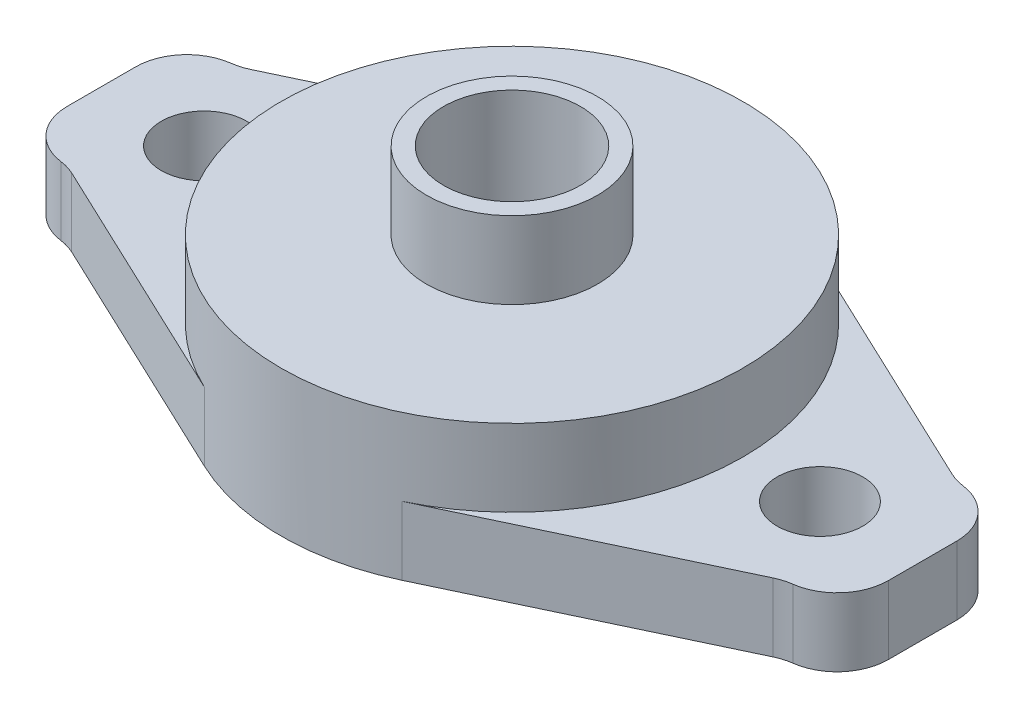
ISO-10303-21;
HEADER;
FILE_DESCRIPTION(('STEP AP214'),'2;1');
FILE_NAME('part.step','',(''),(''),'','','');
FILE_SCHEMA(('AUTOMOTIVE_DESIGN { 1 0 10303 214 1 1 1 1 }'));
ENDSEC;
DATA;
#1=APPLICATION_CONTEXT('core data for automotive mechanical design processes');
#2=APPLICATION_PROTOCOL_DEFINITION('international standard','automotive_design',2000,#1);
#3=PRODUCT_CONTEXT('',#1,'mechanical');
#4=PRODUCT('Part','Part','',(#3));
#5=PRODUCT_RELATED_PRODUCT_CATEGORY('part','',(#4));
#6=PRODUCT_DEFINITION_FORMATION('','',#4);
#7=PRODUCT_DEFINITION_CONTEXT('part definition',#1,'design');
#8=PRODUCT_DEFINITION('design','',#6,#7);
#9=PRODUCT_DEFINITION_SHAPE('','',#8);
#10=(LENGTH_UNIT() NAMED_UNIT(*) SI_UNIT(.MILLI.,.METRE.));
#11=(NAMED_UNIT(*) PLANE_ANGLE_UNIT() SI_UNIT($,.RADIAN.));
#12=(NAMED_UNIT(*) SI_UNIT($,.STERADIAN.) SOLID_ANGLE_UNIT());
#13=UNCERTAINTY_MEASURE_WITH_UNIT(LENGTH_MEASURE(1.E-05),#10,'distance_accuracy_value','');
#14=(GEOMETRIC_REPRESENTATION_CONTEXT(3) GLOBAL_UNCERTAINTY_ASSIGNED_CONTEXT((#13)) GLOBAL_UNIT_ASSIGNED_CONTEXT((#10,
#11,#12)) REPRESENTATION_CONTEXT('',''));
#15=CARTESIAN_POINT('',(0.,0.,0.));
#16=DIRECTION('',(0.,0.,1.));
#17=DIRECTION('',(1.,0.,0.));
#18=AXIS2_PLACEMENT_3D('',#15,#16,#17);
#19=CARTESIAN_POINT('',(0.,8.5,0.));
#20=DIRECTION('',(0.,1.,0.));
#21=DIRECTION('',(0.,0.,1.));
#22=AXIS2_PLACEMENT_3D('',#19,#20,#21);
#23=PLANE('',#22);
#24=CARTESIAN_POINT('',(0.,8.5,0.));
#25=DIRECTION('',(0.,1.,0.));
#26=DIRECTION('',(0.,0.,1.));
#27=AXIS2_PLACEMENT_3D('',#24,#25,#26);
#28=CIRCLE('',#27,13.5);
#29=CARTESIAN_POINT('',(0.,8.5,13.5));
#30=VERTEX_POINT('',#29);
#31=EDGE_CURVE('E197',#30,#30,#28,.T.);
#32=ORIENTED_EDGE('',*,*,#31,.T.);
#33=EDGE_LOOP('',(#32));
#34=FACE_BOUND('',#33,.T.);
#35=CARTESIAN_POINT('',(0.,8.5,0.));
#36=DIRECTION('',(0.,1.,0.));
#37=DIRECTION('',(0.,0.,1.));
#38=AXIS2_PLACEMENT_3D('',#35,#36,#37);
#39=CIRCLE('',#38,5.);
#40=CARTESIAN_POINT('',(0.,8.5,5.));
#41=VERTEX_POINT('',#40);
#42=EDGE_CURVE('E605',#41,#41,#39,.T.);
#43=ORIENTED_EDGE('',*,*,#42,.F.);
#44=EDGE_LOOP('',(#43));
#45=FACE_BOUND('',#44,.T.);
#46=ADVANCED_FACE('F38',(#34,#45),#23,.T.);
#47=CARTESIAN_POINT('',(0.,4.,0.));
#48=DIRECTION('',(0.,1.,0.));
#49=DIRECTION('',(0.,0.,1.));
#50=AXIS2_PLACEMENT_3D('',#47,#48,#49);
#51=PLANE('',#50);
#52=CARTESIAN_POINT('',(0.,4.,0.));
#53=DIRECTION('',(0.,1.,0.));
#54=DIRECTION('',(0.,0.,1.));
#55=AXIS2_PLACEMENT_3D('',#52,#53,#54);
#56=CIRCLE('',#55,13.5);
#57=CARTESIAN_POINT('',(5.7730055029296,4.,12.2033768876957));
#58=VERTEX_POINT('',#57);
#59=CARTESIAN_POINT('',(5.77300550292961,4.,-12.2033768876957));
#60=VERTEX_POINT('',#59);
#61=EDGE_CURVE('E49',#58,#60,#56,.T.);
#62=ORIENTED_EDGE('',*,*,#61,.F.);
#63=DIRECTION('',(-0.903953843533011,0.,0.427630037254045));
#64=VECTOR('',#63,1.);
#65=CARTESIAN_POINT('',(5.77300550292961,4.,12.2033768876957));
#66=LINE('',#65,#64);
#67=CARTESIAN_POINT('',(20.4990932956712,4.,5.23696204642012));
#68=VERTEX_POINT('',#67);
#69=EDGE_CURVE('E241',#68,#58,#66,.T.);
#70=ORIENTED_EDGE('',*,*,#69,.F.);
#71=CARTESIAN_POINT('',(21.7819834074333,4.,7.94882357701915));
#72=DIRECTION('',(0.,1.,0.));
#73=DIRECTION('',(0.,0.,1.));
#74=AXIS2_PLACEMENT_3D('',#71,#72,#73);
#75=CIRCLE('',#74,3.);
#76=CARTESIAN_POINT('',(21.3909917037167,4.,4.97441178850958));
#77=VERTEX_POINT('',#76);
#78=EDGE_CURVE('E284',#77,#68,#75,.T.);
#79=ORIENTED_EDGE('',*,*,#78,.F.);
#80=CARTESIAN_POINT('',(21.,4.,2.));
#81=DIRECTION('',(0.,1.,0.));
#82=DIRECTION('',(0.,0.,1.));
#83=AXIS2_PLACEMENT_3D('',#80,#81,#82);
#84=CIRCLE('',#83,3.);
#85=CARTESIAN_POINT('',(24.,4.,1.99999999999998));
#86=VERTEX_POINT('',#85);
#87=EDGE_CURVE('E292',#86,#77,#84,.F.);
#88=ORIENTED_EDGE('',*,*,#87,.F.);
#89=DIRECTION('',(0.,0.,1.));
#90=VECTOR('',#89,1.);
#91=CARTESIAN_POINT('',(24.,4.,0.));
#92=LINE('',#91,#90);
#93=CARTESIAN_POINT('',(24.,4.,-1.99999999999998));
#94=VERTEX_POINT('',#93);
#95=EDGE_CURVE('E296',#94,#86,#92,.T.);
#96=ORIENTED_EDGE('',*,*,#95,.F.);
#97=CARTESIAN_POINT('',(21.,4.,-2.));
#98=DIRECTION('',(0.,1.,0.));
#99=DIRECTION('',(0.,0.,1.));
#100=AXIS2_PLACEMENT_3D('',#97,#98,#99);
#101=CIRCLE('',#100,3.);
#102=CARTESIAN_POINT('',(21.3909917037167,4.,-4.97441178850957));
#103=VERTEX_POINT('',#102);
#104=EDGE_CURVE('E298',#94,#103,#101,.T.);
#105=ORIENTED_EDGE('',*,*,#104,.T.);
#106=CARTESIAN_POINT('',(21.7819834074333,4.,-7.94882357701915));
#107=DIRECTION('',(0.,1.,0.));
#108=DIRECTION('',(0.,0.,1.));
#109=AXIS2_PLACEMENT_3D('',#106,#107,#108);
#110=CIRCLE('',#109,3.);
#111=CARTESIAN_POINT('',(20.4990932956712,4.,-5.23696204642011));
#112=VERTEX_POINT('',#111);
#113=EDGE_CURVE('E303',#103,#112,#110,.F.);
#114=ORIENTED_EDGE('',*,*,#113,.T.);
#115=DIRECTION('',(-0.903953843533011,0.,-0.427630037254045));
#116=VECTOR('',#115,1.);
#117=CARTESIAN_POINT('',(5.77300550292961,4.,-12.2033768876956));
#118=LINE('',#117,#116);
#119=EDGE_CURVE('E305',#112,#60,#118,.T.);
#120=ORIENTED_EDGE('',*,*,#119,.T.);
#121=EDGE_LOOP('',(#62,#70,#79,#88,#96,#105,#114,#120));
#122=FACE_BOUND('',#121,.T.);
#123=CARTESIAN_POINT('',(18.,4.,0.));
#124=DIRECTION('',(0.,1.,0.));
#125=DIRECTION('',(0.,0.,1.));
#126=AXIS2_PLACEMENT_3D('',#123,#124,#125);
#127=CIRCLE('',#126,2.5);
#128=CARTESIAN_POINT('',(18.,4.,2.5));
#129=VERTEX_POINT('',#128);
#130=EDGE_CURVE('E189',#129,#129,#127,.T.);
#131=ORIENTED_EDGE('',*,*,#130,.F.);
#132=EDGE_LOOP('',(#131));
#133=FACE_BOUND('',#132,.T.);
#134=ADVANCED_FACE('F289',(#122,#133),#51,.T.);
#135=CARTESIAN_POINT('',(5.77300550292961,4.,12.2033768876957));
#136=DIRECTION('',(0.427630037254045,0.,0.903953843533011));
#137=DIRECTION('',(0.903953843533011,0.,-0.427630037254045));
#138=AXIS2_PLACEMENT_3D('',#135,#136,#137);
#139=PLANE('',#138);
#140=DIRECTION('',(-0.903953843533011,0.,0.427630037254045));
#141=VECTOR('',#140,1.);
#142=CARTESIAN_POINT('',(5.77300550292961,0.,12.2033768876957));
#143=LINE('',#142,#141);
#144=CARTESIAN_POINT('',(20.4990932956712,0.,5.23696204642012));
#145=VERTEX_POINT('',#144);
#146=CARTESIAN_POINT('',(5.7730055029296,0.,12.2033768876957));
#147=VERTEX_POINT('',#146);
#148=EDGE_CURVE('E196',#145,#147,#143,.T.);
#149=ORIENTED_EDGE('',*,*,#148,.F.);
#150=DIRECTION('',(0.,-1.,0.));
#151=VECTOR('',#150,1.);
#152=CARTESIAN_POINT('',(20.4990932956712,4.,5.23696204642012));
#153=LINE('',#152,#151);
#154=EDGE_CURVE('E124',#68,#145,#153,.T.);
#155=ORIENTED_EDGE('',*,*,#154,.F.);
#156=ORIENTED_EDGE('',*,*,#69,.T.);
#157=DIRECTION('',(0.,-1.,0.));
#158=VECTOR('',#157,1.);
#159=CARTESIAN_POINT('',(5.7730055029296,4.,12.2033768876957));
#160=LINE('',#159,#158);
#161=EDGE_CURVE('E42',#58,#147,#160,.T.);
#162=ORIENTED_EDGE('',*,*,#161,.T.);
#163=EDGE_LOOP('',(#149,#155,#156,#162));
#164=FACE_BOUND('',#163,.T.);
#165=ADVANCED_FACE('F40',(#164),#139,.T.);
#166=CARTESIAN_POINT('',(21.7819834074333,4.,7.94882357701915));
#167=DIRECTION('',(0.,-1.,0.));
#168=DIRECTION('',(0.,0.,-1.));
#169=AXIS2_PLACEMENT_3D('',#166,#167,#168);
#170=CYLINDRICAL_SURFACE('',#169,3.);
#171=CARTESIAN_POINT('',(21.7819834074333,0.,7.94882357701915));
#172=DIRECTION('',(0.,1.,0.));
#173=DIRECTION('',(0.,0.,1.));
#174=AXIS2_PLACEMENT_3D('',#171,#172,#173);
#175=CIRCLE('',#174,3.);
#176=CARTESIAN_POINT('',(21.3909917037167,0.,4.97441178850958));
#177=VERTEX_POINT('',#176);
#178=EDGE_CURVE('E200',#177,#145,#175,.T.);
#179=ORIENTED_EDGE('',*,*,#178,.F.);
#180=DIRECTION('',(0.,-1.,0.));
#181=VECTOR('',#180,1.);
#182=CARTESIAN_POINT('',(21.3909917037167,4.,4.97441178850958));
#183=LINE('',#182,#181);
#184=EDGE_CURVE('E267',#77,#177,#183,.T.);
#185=ORIENTED_EDGE('',*,*,#184,.F.);
#186=ORIENTED_EDGE('',*,*,#78,.T.);
#187=ORIENTED_EDGE('',*,*,#154,.T.);
#188=EDGE_LOOP('',(#179,#185,#186,#187));
#189=FACE_BOUND('',#188,.T.);
#190=ADVANCED_FACE('F282',(#189),#170,.F.);
#191=CARTESIAN_POINT('',(21.,4.,2.));
#192=DIRECTION('',(0.,-1.,0.));
#193=DIRECTION('',(0.,0.,-1.));
#194=AXIS2_PLACEMENT_3D('',#191,#192,#193);
#195=CYLINDRICAL_SURFACE('',#194,3.);
#196=CARTESIAN_POINT('',(21.,0.,2.));
#197=DIRECTION('',(0.,1.,0.));
#198=DIRECTION('',(0.,0.,1.));
#199=AXIS2_PLACEMENT_3D('',#196,#197,#198);
#200=CIRCLE('',#199,3.);
#201=CARTESIAN_POINT('',(24.,0.,1.99999999999998));
#202=VERTEX_POINT('',#201);
#203=EDGE_CURVE('E203',#202,#177,#200,.F.);
#204=ORIENTED_EDGE('',*,*,#203,.F.);
#205=DIRECTION('',(0.,-1.,0.));
#206=VECTOR('',#205,1.);
#207=CARTESIAN_POINT('',(24.,4.,1.99999999999998));
#208=LINE('',#207,#206);
#209=EDGE_CURVE('E265',#86,#202,#208,.T.);
#210=ORIENTED_EDGE('',*,*,#209,.F.);
#211=ORIENTED_EDGE('',*,*,#87,.T.);
#212=ORIENTED_EDGE('',*,*,#184,.T.);
#213=EDGE_LOOP('',(#204,#210,#211,#212));
#214=FACE_BOUND('',#213,.T.);
#215=ADVANCED_FACE('F295',(#214),#195,.T.);
#216=CARTESIAN_POINT('',(24.,4.,0.));
#217=DIRECTION('',(1.,0.,0.));
#218=DIRECTION('',(0.,0.,-1.));
#219=AXIS2_PLACEMENT_3D('',#216,#217,#218);
#220=PLANE('',#219);
#221=DIRECTION('',(0.,0.,1.));
#222=VECTOR('',#221,1.);
#223=CARTESIAN_POINT('',(24.,0.,0.));
#224=LINE('',#223,#222);
#225=CARTESIAN_POINT('',(24.,0.,-1.99999999999998));
#226=VERTEX_POINT('',#225);
#227=EDGE_CURVE('E206',#226,#202,#224,.T.);
#228=ORIENTED_EDGE('',*,*,#227,.F.);
#229=DIRECTION('',(0.,-1.,0.));
#230=VECTOR('',#229,1.);
#231=CARTESIAN_POINT('',(24.,4.,-1.99999999999998));
#232=LINE('',#231,#230);
#233=EDGE_CURVE('E263',#94,#226,#232,.T.);
#234=ORIENTED_EDGE('',*,*,#233,.F.);
#235=ORIENTED_EDGE('',*,*,#95,.T.);
#236=ORIENTED_EDGE('',*,*,#209,.T.);
#237=EDGE_LOOP('',(#228,#234,#235,#236));
#238=FACE_BOUND('',#237,.T.);
#239=ADVANCED_FACE('F345',(#238),#220,.T.);
#240=CARTESIAN_POINT('',(21.,4.,-2.));
#241=DIRECTION('',(0.,-1.,0.));
#242=DIRECTION('',(0.,0.,-1.));
#243=AXIS2_PLACEMENT_3D('',#240,#241,#242);
#244=CYLINDRICAL_SURFACE('',#243,3.);
#245=CARTESIAN_POINT('',(21.,0.,-2.));
#246=DIRECTION('',(0.,1.,0.));
#247=DIRECTION('',(0.,0.,1.));
#248=AXIS2_PLACEMENT_3D('',#245,#246,#247);
#249=CIRCLE('',#248,3.);
#250=CARTESIAN_POINT('',(21.3909917037167,0.,-4.97441178850957));
#251=VERTEX_POINT('',#250);
#252=EDGE_CURVE('E209',#226,#251,#249,.T.);
#253=ORIENTED_EDGE('',*,*,#252,.T.);
#254=DIRECTION('',(0.,-1.,0.));
#255=VECTOR('',#254,1.);
#256=CARTESIAN_POINT('',(21.3909917037167,4.,-4.97441178850957));
#257=LINE('',#256,#255);
#258=EDGE_CURVE('E260',#103,#251,#257,.T.);
#259=ORIENTED_EDGE('',*,*,#258,.F.);
#260=ORIENTED_EDGE('',*,*,#104,.F.);
#261=ORIENTED_EDGE('',*,*,#233,.T.);
#262=EDGE_LOOP('',(#253,#259,#260,#261));
#263=FACE_BOUND('',#262,.T.);
#264=ADVANCED_FACE('F347',(#263),#244,.T.);
#265=CARTESIAN_POINT('',(21.7819834074333,4.,-7.94882357701915));
#266=DIRECTION('',(0.,-1.,0.));
#267=DIRECTION('',(0.,0.,-1.));
#268=AXIS2_PLACEMENT_3D('',#265,#266,#267);
#269=CYLINDRICAL_SURFACE('',#268,3.);
#270=CARTESIAN_POINT('',(21.7819834074333,0.,-7.94882357701915));
#271=DIRECTION('',(0.,1.,0.));
#272=DIRECTION('',(0.,0.,1.));
#273=AXIS2_PLACEMENT_3D('',#270,#271,#272);
#274=CIRCLE('',#273,3.);
#275=CARTESIAN_POINT('',(20.4990932956712,0.,-5.23696204642011));
#276=VERTEX_POINT('',#275);
#277=EDGE_CURVE('E211',#251,#276,#274,.F.);
#278=ORIENTED_EDGE('',*,*,#277,.T.);
#279=DIRECTION('',(0.,-1.,0.));
#280=VECTOR('',#279,1.);
#281=CARTESIAN_POINT('',(20.4990932956712,4.,-5.23696204642011));
#282=LINE('',#281,#280);
#283=EDGE_CURVE('E257',#112,#276,#282,.T.);
#284=ORIENTED_EDGE('',*,*,#283,.F.);
#285=ORIENTED_EDGE('',*,*,#113,.F.);
#286=ORIENTED_EDGE('',*,*,#258,.T.);
#287=EDGE_LOOP('',(#278,#284,#285,#286));
#288=FACE_BOUND('',#287,.T.);
#289=ADVANCED_FACE('F339',(#288),#269,.F.);
#290=CARTESIAN_POINT('',(5.77300550292961,4.,-12.2033768876956));
#291=DIRECTION('',(-0.427630037254045,0.,0.903953843533011));
#292=DIRECTION('',(0.903953843533011,0.,0.427630037254045));
#293=AXIS2_PLACEMENT_3D('',#290,#291,#292);
#294=PLANE('',#293);
#295=DIRECTION('',(-0.903953843533011,0.,-0.427630037254045));
#296=VECTOR('',#295,1.);
#297=CARTESIAN_POINT('',(5.77300550292961,0.,-12.2033768876956));
#298=LINE('',#297,#296);
#299=CARTESIAN_POINT('',(5.77300550292961,0.,-12.2033768876957));
#300=VERTEX_POINT('',#299);
#301=EDGE_CURVE('E213',#276,#300,#298,.T.);
#302=ORIENTED_EDGE('',*,*,#301,.T.);
#303=DIRECTION('',(0.,-1.,0.));
#304=VECTOR('',#303,1.);
#305=CARTESIAN_POINT('',(5.77300550292961,4.,-12.2033768876957));
#306=LINE('',#305,#304);
#307=EDGE_CURVE('E254',#60,#300,#306,.T.);
#308=ORIENTED_EDGE('',*,*,#307,.F.);
#309=ORIENTED_EDGE('',*,*,#119,.F.);
#310=ORIENTED_EDGE('',*,*,#283,.T.);
#311=EDGE_LOOP('',(#302,#308,#309,#310));
#312=FACE_BOUND('',#311,.T.);
#313=ADVANCED_FACE('F335',(#312),#294,.F.);
#314=CARTESIAN_POINT('',(0.,4.,0.));
#315=DIRECTION('',(0.,-1.,0.));
#316=DIRECTION('',(0.,0.,-1.));
#317=AXIS2_PLACEMENT_3D('',#314,#315,#316);
#318=CYLINDRICAL_SURFACE('',#317,13.5);
#319=CARTESIAN_POINT('',(0.,0.,0.));
#320=DIRECTION('',(0.,1.,0.));
#321=DIRECTION('',(0.,0.,1.));
#322=AXIS2_PLACEMENT_3D('',#319,#320,#321);
#323=CIRCLE('',#322,13.5);
#324=CARTESIAN_POINT('',(-5.77300550292961,0.,-12.2033768876957));
#325=VERTEX_POINT('',#324);
#326=EDGE_CURVE('E215',#300,#325,#323,.T.);
#327=ORIENTED_EDGE('',*,*,#326,.T.);
#328=DIRECTION('',(0.,-1.,0.));
#329=VECTOR('',#328,1.);
#330=CARTESIAN_POINT('',(-5.77300550292961,4.,-12.2033768876957));
#331=LINE('',#330,#329);
#332=CARTESIAN_POINT('',(-5.77300550292961,4.,-12.2033768876957));
#333=VERTEX_POINT('',#332);
#334=EDGE_CURVE('E252',#333,#325,#331,.T.);
#335=ORIENTED_EDGE('',*,*,#334,.F.);
#336=CARTESIAN_POINT('',(-5.77300550292961,4.,12.2033768876957));
#337=VERTEX_POINT('',#336);
#338=EDGE_CURVE('E11',#333,#337,#56,.T.);
#339=ORIENTED_EDGE('',*,*,#338,.T.);
#340=DIRECTION('',(0.,-1.,0.));
#341=VECTOR('',#340,1.);
#342=CARTESIAN_POINT('',(-5.77300550292961,4.,12.2033768876957));
#343=LINE('',#342,#341);
#344=CARTESIAN_POINT('',(-5.77300550292961,0.,12.2033768876957));
#345=VERTEX_POINT('',#344);
#346=EDGE_CURVE('E192',#337,#345,#343,.T.);
#347=ORIENTED_EDGE('',*,*,#346,.T.);
#348=CARTESIAN_POINT('',(0.,0.,0.));
#349=DIRECTION('',(0.,1.,0.));
#350=DIRECTION('',(0.,0.,1.));
#351=AXIS2_PLACEMENT_3D('',#348,#349,#350);
#352=CIRCLE('',#351,13.5);
#353=EDGE_CURVE('E193',#345,#147,#352,.T.);
#354=ORIENTED_EDGE('',*,*,#353,.T.);
#355=ORIENTED_EDGE('',*,*,#161,.F.);
#356=ORIENTED_EDGE('',*,*,#61,.T.);
#357=ORIENTED_EDGE('',*,*,#307,.T.);
#358=EDGE_LOOP('',(#327,#335,#339,#347,#354,#355,#356,#357));
#359=FACE_BOUND('',#358,.T.);
#360=ORIENTED_EDGE('',*,*,#31,.F.);
#361=EDGE_LOOP('',(#360));
#362=FACE_BOUND('',#361,.T.);
#363=ADVANCED_FACE('F276',(#359,#362),#318,.T.);
#364=CARTESIAN_POINT('',(-5.77300550292961,4.,-12.2033768876957));
#365=DIRECTION('',(-0.427630037254045,0.,-0.903953843533011));
#366=DIRECTION('',(-0.903953843533012,0.,0.427630037254045));
#367=AXIS2_PLACEMENT_3D('',#364,#365,#366);
#368=PLANE('',#367);
#369=DIRECTION('',(0.903953843533012,0.,-0.427630037254045));
#370=VECTOR('',#369,1.);
#371=CARTESIAN_POINT('',(-5.77300550292961,0.,-12.2033768876957));
#372=LINE('',#371,#370);
#373=CARTESIAN_POINT('',(-20.4990932956712,0.,-5.23696204642011));
#374=VERTEX_POINT('',#373);
#375=EDGE_CURVE('E218',#374,#325,#372,.T.);
#376=ORIENTED_EDGE('',*,*,#375,.F.);
#377=DIRECTION('',(0.,-1.,0.));
#378=VECTOR('',#377,1.);
#379=CARTESIAN_POINT('',(-20.4990932956712,4.,-5.23696204642011));
#380=LINE('',#379,#378);
#381=CARTESIAN_POINT('',(-20.4990932956712,4.,-5.23696204642011));
#382=VERTEX_POINT('',#381);
#383=EDGE_CURVE('E250',#382,#374,#380,.T.);
#384=ORIENTED_EDGE('',*,*,#383,.F.);
#385=DIRECTION('',(0.903953843533012,0.,-0.427630037254045));
#386=VECTOR('',#385,1.);
#387=CARTESIAN_POINT('',(-5.77300550292961,4.,-12.2033768876957));
#388=LINE('',#387,#386);
#389=EDGE_CURVE('E307',#382,#333,#388,.T.);
#390=ORIENTED_EDGE('',*,*,#389,.T.);
#391=ORIENTED_EDGE('',*,*,#334,.T.);
#392=EDGE_LOOP('',(#376,#384,#390,#391));
#393=FACE_BOUND('',#392,.T.);
#394=ADVANCED_FACE('F327',(#393),#368,.T.);
#395=CARTESIAN_POINT('',(-21.7819834074334,4.,-7.94882357701915));
#396=DIRECTION('',(0.,-1.,0.));
#397=DIRECTION('',(0.,0.,-1.));
#398=AXIS2_PLACEMENT_3D('',#395,#396,#397);
#399=CYLINDRICAL_SURFACE('',#398,3.);
#400=CARTESIAN_POINT('',(-21.7819834074334,0.,-7.94882357701915));
#401=DIRECTION('',(0.,1.,0.));
#402=DIRECTION('',(0.,0.,1.));
#403=AXIS2_PLACEMENT_3D('',#400,#401,#402);
#404=CIRCLE('',#403,3.);
#405=CARTESIAN_POINT('',(-21.3909917037167,0.,-4.97441178850957));
#406=VERTEX_POINT('',#405);
#407=EDGE_CURVE('E221',#406,#374,#404,.T.);
#408=ORIENTED_EDGE('',*,*,#407,.F.);
#409=DIRECTION('',(0.,-1.,0.));
#410=VECTOR('',#409,1.);
#411=CARTESIAN_POINT('',(-21.3909917037167,4.,-4.97441178850957));
#412=LINE('',#411,#410);
#413=CARTESIAN_POINT('',(-21.3909917037167,4.,-4.97441178850957));
#414=VERTEX_POINT('',#413);
#415=EDGE_CURVE('E248',#414,#406,#412,.T.);
#416=ORIENTED_EDGE('',*,*,#415,.F.);
#417=CARTESIAN_POINT('',(-21.7819834074334,4.,-7.94882357701915));
#418=DIRECTION('',(0.,1.,0.));
#419=DIRECTION('',(0.,0.,1.));
#420=AXIS2_PLACEMENT_3D('',#417,#418,#419);
#421=CIRCLE('',#420,3.);
#422=EDGE_CURVE('E310',#414,#382,#421,.T.);
#423=ORIENTED_EDGE('',*,*,#422,.T.);
#424=ORIENTED_EDGE('',*,*,#383,.T.);
#425=EDGE_LOOP('',(#408,#416,#423,#424));
#426=FACE_BOUND('',#425,.T.);
#427=ADVANCED_FACE('F324',(#426),#399,.F.);
#428=CARTESIAN_POINT('',(-21.,4.,-2.));
#429=DIRECTION('',(0.,-1.,0.));
#430=DIRECTION('',(0.,0.,-1.));
#431=AXIS2_PLACEMENT_3D('',#428,#429,#430);
#432=CYLINDRICAL_SURFACE('',#431,3.);
#433=CARTESIAN_POINT('',(-21.,0.,-2.));
#434=DIRECTION('',(0.,1.,0.));
#435=DIRECTION('',(0.,0.,1.));
#436=AXIS2_PLACEMENT_3D('',#433,#434,#435);
#437=CIRCLE('',#436,3.);
#438=CARTESIAN_POINT('',(-24.,0.,-1.99999999999998));
#439=VERTEX_POINT('',#438);
#440=EDGE_CURVE('E224',#406,#439,#437,.T.);
#441=ORIENTED_EDGE('',*,*,#440,.T.);
#442=DIRECTION('',(0.,-1.,0.));
#443=VECTOR('',#442,1.);
#444=CARTESIAN_POINT('',(-24.,4.,-1.99999999999998));
#445=LINE('',#444,#443);
#446=CARTESIAN_POINT('',(-24.,4.,-1.99999999999998));
#447=VERTEX_POINT('',#446);
#448=EDGE_CURVE('E245',#447,#439,#445,.T.);
#449=ORIENTED_EDGE('',*,*,#448,.F.);
#450=CARTESIAN_POINT('',(-21.,4.,-2.));
#451=DIRECTION('',(0.,1.,0.));
#452=DIRECTION('',(0.,0.,1.));
#453=AXIS2_PLACEMENT_3D('',#450,#451,#452);
#454=CIRCLE('',#453,3.);
#455=EDGE_CURVE('E181',#414,#447,#454,.T.);
#456=ORIENTED_EDGE('',*,*,#455,.F.);
#457=ORIENTED_EDGE('',*,*,#415,.T.);
#458=EDGE_LOOP('',(#441,#449,#456,#457));
#459=FACE_BOUND('',#458,.T.);
#460=ADVANCED_FACE('F317',(#459),#432,.T.);
#461=CARTESIAN_POINT('',(-24.,4.,0.));
#462=DIRECTION('',(1.,0.,0.));
#463=DIRECTION('',(0.,0.,-1.));
#464=AXIS2_PLACEMENT_3D('',#461,#462,#463);
#465=PLANE('',#464);
#466=DIRECTION('',(0.,0.,1.));
#467=VECTOR('',#466,1.);
#468=CARTESIAN_POINT('',(-24.,0.,0.));
#469=LINE('',#468,#467);
#470=CARTESIAN_POINT('',(-24.,0.,1.99999999999998));
#471=VERTEX_POINT('',#470);
#472=EDGE_CURVE('E226',#439,#471,#469,.T.);
#473=ORIENTED_EDGE('',*,*,#472,.T.);
#474=DIRECTION('',(0.,-1.,0.));
#475=VECTOR('',#474,1.);
#476=CARTESIAN_POINT('',(-24.,4.,1.99999999999998));
#477=LINE('',#476,#475);
#478=CARTESIAN_POINT('',(-24.,4.,1.99999999999998));
#479=VERTEX_POINT('',#478);
#480=EDGE_CURVE('E169',#479,#471,#477,.T.);
#481=ORIENTED_EDGE('',*,*,#480,.F.);
#482=DIRECTION('',(0.,0.,1.));
#483=VECTOR('',#482,1.);
#484=CARTESIAN_POINT('',(-24.,4.,0.));
#485=LINE('',#484,#483);
#486=EDGE_CURVE('E178',#447,#479,#485,.T.);
#487=ORIENTED_EDGE('',*,*,#486,.F.);
#488=ORIENTED_EDGE('',*,*,#448,.T.);
#489=EDGE_LOOP('',(#473,#481,#487,#488));
#490=FACE_BOUND('',#489,.T.);
#491=ADVANCED_FACE('F321',(#490),#465,.F.);
#492=CARTESIAN_POINT('',(-21.,4.,2.));
#493=DIRECTION('',(0.,-1.,0.));
#494=DIRECTION('',(0.,0.,-1.));
#495=AXIS2_PLACEMENT_3D('',#492,#493,#494);
#496=CYLINDRICAL_SURFACE('',#495,3.);
#497=CARTESIAN_POINT('',(-21.,0.,2.));
#498=DIRECTION('',(0.,1.,0.));
#499=DIRECTION('',(0.,0.,1.));
#500=AXIS2_PLACEMENT_3D('',#497,#498,#499);
#501=CIRCLE('',#500,3.);
#502=CARTESIAN_POINT('',(-21.3909917037167,0.,4.97441178850958));
#503=VERTEX_POINT('',#502);
#504=EDGE_CURVE('E168',#503,#471,#501,.F.);
#505=ORIENTED_EDGE('',*,*,#504,.F.);
#506=DIRECTION('',(0.,-1.,0.));
#507=VECTOR('',#506,1.);
#508=CARTESIAN_POINT('',(-21.3909917037167,4.,4.97441178850958));
#509=LINE('',#508,#507);
#510=CARTESIAN_POINT('',(-21.3909917037167,4.,4.97441178850958));
#511=VERTEX_POINT('',#510);
#512=EDGE_CURVE('E162',#511,#503,#509,.T.);
#513=ORIENTED_EDGE('',*,*,#512,.F.);
#514=CARTESIAN_POINT('',(-21.,4.,2.));
#515=DIRECTION('',(0.,1.,0.));
#516=DIRECTION('',(0.,0.,1.));
#517=AXIS2_PLACEMENT_3D('',#514,#515,#516);
#518=CIRCLE('',#517,3.);
#519=EDGE_CURVE('E166',#511,#479,#518,.F.);
#520=ORIENTED_EDGE('',*,*,#519,.T.);
#521=ORIENTED_EDGE('',*,*,#480,.T.);
#522=EDGE_LOOP('',(#505,#513,#520,#521));
#523=FACE_BOUND('',#522,.T.);
#524=ADVANCED_FACE('F164',(#523),#496,.T.);
#525=CARTESIAN_POINT('',(-21.7819834074333,4.,7.94882357701915));
#526=DIRECTION('',(0.,-1.,0.));
#527=DIRECTION('',(0.,0.,-1.));
#528=AXIS2_PLACEMENT_3D('',#525,#526,#527);
#529=CYLINDRICAL_SURFACE('',#528,3.);
#530=CARTESIAN_POINT('',(-21.7819834074333,0.,7.94882357701915));
#531=DIRECTION('',(0.,1.,0.));
#532=DIRECTION('',(0.,0.,1.));
#533=AXIS2_PLACEMENT_3D('',#530,#531,#532);
#534=CIRCLE('',#533,3.);
#535=CARTESIAN_POINT('',(-20.4990932956712,0.,5.23696204642012));
#536=VERTEX_POINT('',#535);
#537=EDGE_CURVE('E110',#503,#536,#534,.F.);
#538=ORIENTED_EDGE('',*,*,#537,.T.);
#539=DIRECTION('',(0.,-1.,0.));
#540=VECTOR('',#539,1.);
#541=CARTESIAN_POINT('',(-20.4990932956712,4.,5.23696204642012));
#542=LINE('',#541,#540);
#543=CARTESIAN_POINT('',(-20.4990932956712,4.,5.23696204642012));
#544=VERTEX_POINT('',#543);
#545=EDGE_CURVE('E170',#544,#536,#542,.T.);
#546=ORIENTED_EDGE('',*,*,#545,.F.);
#547=CARTESIAN_POINT('',(-21.7819834074333,4.,7.94882357701915));
#548=DIRECTION('',(0.,1.,0.));
#549=DIRECTION('',(0.,0.,1.));
#550=AXIS2_PLACEMENT_3D('',#547,#548,#549);
#551=CIRCLE('',#550,3.);
#552=EDGE_CURVE('E172',#511,#544,#551,.F.);
#553=ORIENTED_EDGE('',*,*,#552,.F.);
#554=ORIENTED_EDGE('',*,*,#512,.T.);
#555=EDGE_LOOP('',(#538,#546,#553,#554));
#556=FACE_BOUND('',#555,.T.);
#557=ADVANCED_FACE('F173',(#556),#529,.F.);
#558=CARTESIAN_POINT('',(0.,4.,0.));
#559=DIRECTION('',(0.,-1.,0.));
#560=DIRECTION('',(0.,0.,-1.));
#561=AXIS2_PLACEMENT_3D('',#558,#559,#560);
#562=CYLINDRICAL_SURFACE('',#561,4.);
#563=CARTESIAN_POINT('',(0.,0.,0.));
#564=DIRECTION('',(0.,1.,0.));
#565=DIRECTION('',(0.,0.,1.));
#566=AXIS2_PLACEMENT_3D('',#563,#564,#565);
#567=CIRCLE('',#566,4.);
#568=CARTESIAN_POINT('',(0.,0.,4.));
#569=VERTEX_POINT('',#568);
#570=EDGE_CURVE('E235',#569,#569,#567,.T.);
#571=ORIENTED_EDGE('',*,*,#570,.F.);
#572=EDGE_LOOP('',(#571));
#573=FACE_BOUND('',#572,.T.);
#574=CARTESIAN_POINT('',(0.,13.,0.));
#575=DIRECTION('',(0.,1.,0.));
#576=DIRECTION('',(0.,0.,1.));
#577=AXIS2_PLACEMENT_3D('',#574,#575,#576);
#578=CIRCLE('',#577,4.);
#579=CARTESIAN_POINT('',(0.,13.,4.));
#580=VERTEX_POINT('',#579);
#581=EDGE_CURVE('E606',#580,#580,#578,.T.);
#582=ORIENTED_EDGE('',*,*,#581,.T.);
#583=EDGE_LOOP('',(#582));
#584=FACE_BOUND('',#583,.T.);
#585=ADVANCED_FACE('F378',(#573,#584),#562,.F.);
#586=CARTESIAN_POINT('',(-18.,4.,0.));
#587=DIRECTION('',(0.,-1.,0.));
#588=DIRECTION('',(0.,0.,-1.));
#589=AXIS2_PLACEMENT_3D('',#586,#587,#588);
#590=CYLINDRICAL_SURFACE('',#589,2.5);
#591=CARTESIAN_POINT('',(-18.,4.,0.));
#592=DIRECTION('',(0.,1.,0.));
#593=DIRECTION('',(0.,0.,1.));
#594=AXIS2_PLACEMENT_3D('',#591,#592,#593);
#595=CIRCLE('',#594,2.5);
#596=CARTESIAN_POINT('',(-18.,4.,2.5));
#597=VERTEX_POINT('',#596);
#598=EDGE_CURVE('E186',#597,#597,#595,.F.);
#599=ORIENTED_EDGE('',*,*,#598,.F.);
#600=EDGE_LOOP('',(#599));
#601=FACE_BOUND('',#600,.T.);
#602=CARTESIAN_POINT('',(-18.,0.,0.));
#603=DIRECTION('',(0.,1.,0.));
#604=DIRECTION('',(0.,0.,1.));
#605=AXIS2_PLACEMENT_3D('',#602,#603,#604);
#606=CIRCLE('',#605,2.5);
#607=CARTESIAN_POINT('',(-18.,0.,2.5));
#608=VERTEX_POINT('',#607);
#609=EDGE_CURVE('E232',#608,#608,#606,.F.);
#610=ORIENTED_EDGE('',*,*,#609,.T.);
#611=EDGE_LOOP('',(#610));
#612=FACE_BOUND('',#611,.T.);
#613=ADVANCED_FACE('F381',(#601,#612),#590,.F.);
#614=CARTESIAN_POINT('',(-5.77300550292961,4.,12.2033768876956));
#615=DIRECTION('',(0.427630037254045,0.,-0.903953843533011));
#616=DIRECTION('',(-0.903953843533011,0.,-0.427630037254045));
#617=AXIS2_PLACEMENT_3D('',#614,#615,#616);
#618=PLANE('',#617);
#619=DIRECTION('',(0.903953843533011,0.,0.427630037254045));
#620=VECTOR('',#619,1.);
#621=CARTESIAN_POINT('',(-5.77300550292961,0.,12.2033768876956));
#622=LINE('',#621,#620);
#623=EDGE_CURVE('E116',#536,#345,#622,.T.);
#624=ORIENTED_EDGE('',*,*,#623,.T.);
#625=ORIENTED_EDGE('',*,*,#346,.F.);
#626=DIRECTION('',(0.903953843533011,0.,0.427630037254045));
#627=VECTOR('',#626,1.);
#628=CARTESIAN_POINT('',(-5.77300550292961,4.,12.2033768876956));
#629=LINE('',#628,#627);
#630=EDGE_CURVE('E57',#544,#337,#629,.T.);
#631=ORIENTED_EDGE('',*,*,#630,.F.);
#632=ORIENTED_EDGE('',*,*,#545,.T.);
#633=EDGE_LOOP('',(#624,#625,#631,#632));
#634=FACE_BOUND('',#633,.T.);
#635=ADVANCED_FACE('F376',(#634),#618,.F.);
#636=CARTESIAN_POINT('',(18.,4.,0.));
#637=DIRECTION('',(0.,-1.,0.));
#638=DIRECTION('',(0.,0.,-1.));
#639=AXIS2_PLACEMENT_3D('',#636,#637,#638);
#640=CYLINDRICAL_SURFACE('',#639,2.5);
#641=ORIENTED_EDGE('',*,*,#130,.T.);
#642=EDGE_LOOP('',(#641));
#643=FACE_BOUND('',#642,.T.);
#644=CARTESIAN_POINT('',(18.,0.,0.));
#645=DIRECTION('',(0.,1.,0.));
#646=DIRECTION('',(0.,0.,1.));
#647=AXIS2_PLACEMENT_3D('',#644,#645,#646);
#648=CIRCLE('',#647,2.5);
#649=CARTESIAN_POINT('',(18.,0.,2.5));
#650=VERTEX_POINT('',#649);
#651=EDGE_CURVE('E238',#650,#650,#648,.T.);
#652=ORIENTED_EDGE('',*,*,#651,.F.);
#653=EDGE_LOOP('',(#652));
#654=FACE_BOUND('',#653,.T.);
#655=ADVANCED_FACE('F370',(#643,#654),#640,.F.);
#656=ORIENTED_EDGE('',*,*,#338,.F.);
#657=ORIENTED_EDGE('',*,*,#389,.F.);
#658=ORIENTED_EDGE('',*,*,#422,.F.);
#659=ORIENTED_EDGE('',*,*,#455,.T.);
#660=ORIENTED_EDGE('',*,*,#486,.T.);
#661=ORIENTED_EDGE('',*,*,#519,.F.);
#662=ORIENTED_EDGE('',*,*,#552,.T.);
#663=ORIENTED_EDGE('',*,*,#630,.T.);
#664=EDGE_LOOP('',(#656,#657,#658,#659,#660,#661,#662,#663));
#665=FACE_BOUND('',#664,.T.);
#666=ORIENTED_EDGE('',*,*,#598,.T.);
#667=EDGE_LOOP('',(#666));
#668=FACE_BOUND('',#667,.T.);
#669=ADVANCED_FACE('F175',(#665,#668),#51,.T.);
#670=CARTESIAN_POINT('',(0.,0.,0.));
#671=DIRECTION('',(0.,1.,0.));
#672=DIRECTION('',(0.,0.,1.));
#673=AXIS2_PLACEMENT_3D('',#670,#671,#672);
#674=PLANE('',#673);
#675=ORIENTED_EDGE('',*,*,#353,.F.);
#676=ORIENTED_EDGE('',*,*,#623,.F.);
#677=ORIENTED_EDGE('',*,*,#537,.F.);
#678=ORIENTED_EDGE('',*,*,#504,.T.);
#679=ORIENTED_EDGE('',*,*,#472,.F.);
#680=ORIENTED_EDGE('',*,*,#440,.F.);
#681=ORIENTED_EDGE('',*,*,#407,.T.);
#682=ORIENTED_EDGE('',*,*,#375,.T.);
#683=ORIENTED_EDGE('',*,*,#326,.F.);
#684=ORIENTED_EDGE('',*,*,#301,.F.);
#685=ORIENTED_EDGE('',*,*,#277,.F.);
#686=ORIENTED_EDGE('',*,*,#252,.F.);
#687=ORIENTED_EDGE('',*,*,#227,.T.);
#688=ORIENTED_EDGE('',*,*,#203,.T.);
#689=ORIENTED_EDGE('',*,*,#178,.T.);
#690=ORIENTED_EDGE('',*,*,#148,.T.);
#691=EDGE_LOOP('',(#675,#676,#677,#678,#679,#680,#681,#682,#683,#684,#685,#686,#687,#688,#689,#690));
#692=FACE_BOUND('',#691,.T.);
#693=ORIENTED_EDGE('',*,*,#609,.F.);
#694=EDGE_LOOP('',(#693));
#695=FACE_BOUND('',#694,.T.);
#696=ORIENTED_EDGE('',*,*,#570,.T.);
#697=EDGE_LOOP('',(#696));
#698=FACE_BOUND('',#697,.T.);
#699=ORIENTED_EDGE('',*,*,#651,.T.);
#700=EDGE_LOOP('',(#699));
#701=FACE_BOUND('',#700,.T.);
#702=ADVANCED_FACE('F279',(#692,#695,#698,#701),#674,.F.);
#703=CARTESIAN_POINT('',(0.,13.,0.));
#704=DIRECTION('',(0.,1.,0.));
#705=DIRECTION('',(0.,0.,1.));
#706=AXIS2_PLACEMENT_3D('',#703,#704,#705);
#707=PLANE('',#706);
#708=CARTESIAN_POINT('',(0.,13.,0.));
#709=DIRECTION('',(0.,1.,0.));
#710=DIRECTION('',(0.,0.,1.));
#711=AXIS2_PLACEMENT_3D('',#708,#709,#710);
#712=CIRCLE('',#711,5.);
#713=CARTESIAN_POINT('',(0.,13.,5.));
#714=VERTEX_POINT('',#713);
#715=EDGE_CURVE('E602',#714,#714,#712,.T.);
#716=ORIENTED_EDGE('',*,*,#715,.T.);
#717=EDGE_LOOP('',(#716));
#718=FACE_BOUND('',#717,.T.);
#719=ORIENTED_EDGE('',*,*,#581,.F.);
#720=EDGE_LOOP('',(#719));
#721=FACE_BOUND('',#720,.T.);
#722=ADVANCED_FACE('F373',(#718,#721),#707,.T.);
#723=CARTESIAN_POINT('',(0.,13.,0.));
#724=DIRECTION('',(0.,-1.,0.));
#725=DIRECTION('',(0.,0.,-1.));
#726=AXIS2_PLACEMENT_3D('',#723,#724,#725);
#727=CYLINDRICAL_SURFACE('',#726,5.);
#728=ORIENTED_EDGE('',*,*,#715,.F.);
#729=EDGE_LOOP('',(#728));
#730=FACE_BOUND('',#729,.T.);
#731=ORIENTED_EDGE('',*,*,#42,.T.);
#732=EDGE_LOOP('',(#731));
#733=FACE_BOUND('',#732,.T.);
#734=ADVANCED_FACE('F366',(#730,#733),#727,.T.);
#735=CLOSED_SHELL('',(#46,#134,#165,#190,#215,#239,#264,#289,#313,#363,#394,#427,#460,#491,#524,
#557,#585,#613,#635,#655,#669,#702,#722,#734));
#736=MANIFOLD_SOLID_BREP('B2',#735);
#737=ADVANCED_BREP_SHAPE_REPRESENTATION('',(#18,#736),#14);
#738=SHAPE_DEFINITION_REPRESENTATION(#9,#737);
ENDSEC;
END-ISO-10303-21;
